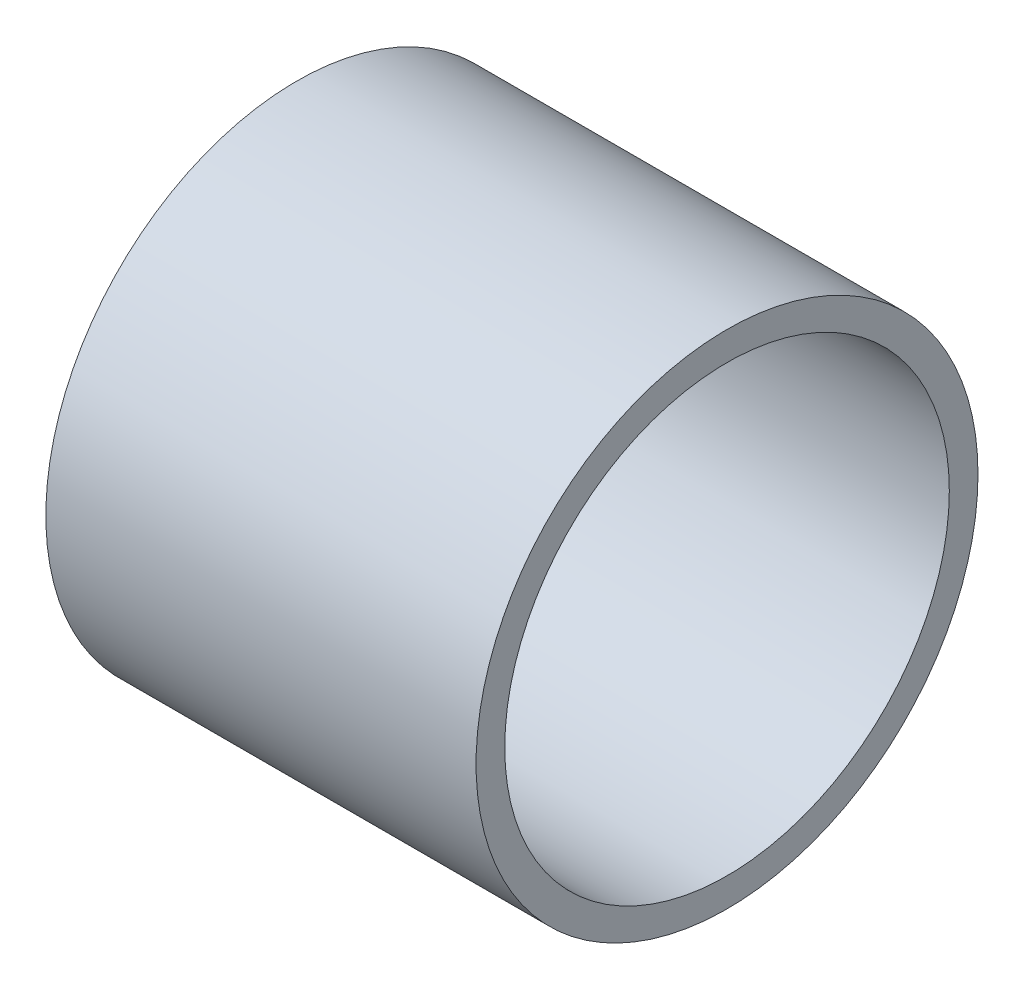
ISO-10303-21;
HEADER;
FILE_DESCRIPTION(('STEP AP214'),'2;1');
FILE_NAME('part.step','',(''),(''),'','','');
FILE_SCHEMA(('AUTOMOTIVE_DESIGN { 1 0 10303 214 1 1 1 1 }'));
ENDSEC;
DATA;
#1=APPLICATION_CONTEXT('core data for automotive mechanical design processes');
#2=APPLICATION_PROTOCOL_DEFINITION('international standard','automotive_design',2000,#1);
#3=PRODUCT_CONTEXT('',#1,'mechanical');
#4=PRODUCT('Part','Part','',(#3));
#5=PRODUCT_RELATED_PRODUCT_CATEGORY('part','',(#4));
#6=PRODUCT_DEFINITION_FORMATION('','',#4);
#7=PRODUCT_DEFINITION_CONTEXT('part definition',#1,'design');
#8=PRODUCT_DEFINITION('design','',#6,#7);
#9=PRODUCT_DEFINITION_SHAPE('','',#8);
#10=(LENGTH_UNIT() NAMED_UNIT(*) SI_UNIT(.MILLI.,.METRE.));
#11=(NAMED_UNIT(*) PLANE_ANGLE_UNIT() SI_UNIT($,.RADIAN.));
#12=(NAMED_UNIT(*) SI_UNIT($,.STERADIAN.) SOLID_ANGLE_UNIT());
#13=UNCERTAINTY_MEASURE_WITH_UNIT(LENGTH_MEASURE(1.E-05),#10,'distance_accuracy_value','');
#14=(GEOMETRIC_REPRESENTATION_CONTEXT(3) GLOBAL_UNCERTAINTY_ASSIGNED_CONTEXT((#13)) GLOBAL_UNIT_ASSIGNED_CONTEXT((#10,
#11,#12)) REPRESENTATION_CONTEXT('',''));
#15=CARTESIAN_POINT('',(0.,0.,0.));
#16=DIRECTION('',(0.,0.,1.));
#17=DIRECTION('',(1.,0.,0.));
#18=AXIS2_PLACEMENT_3D('',#15,#16,#17);
#19=CARTESIAN_POINT('',(60.0000000000001,-2.77555756156289E-13,-1.11022302462516E-12));
#20=DIRECTION('',(1.,0.,0.));
#21=DIRECTION('',(0.,0.,-1.00000000000001));
#22=AXIS2_PLACEMENT_3D('',#19,#20,#21);
#23=PLANE('',#22);
#24=CARTESIAN_POINT('',(60.0000000000001,-2.77555756156289E-13,-1.11022302462516E-12));
#25=DIRECTION('',(1.,0.,0.));
#26=DIRECTION('',(0.,0.,-1.00000000000001));
#27=AXIS2_PLACEMENT_3D('',#24,#25,#26);
#28=CIRCLE('',#27,35.);
#29=CARTESIAN_POINT('',(60.0000000000001,-2.7075564013046E-13,-35.0000000000014));
#30=VERTEX_POINT('',#29);
#31=EDGE_CURVE('E10',#30,#30,#28,.T.);
#32=ORIENTED_EDGE('',*,*,#31,.T.);
#33=EDGE_LOOP('',(#32));
#34=FACE_BOUND('',#33,.T.);
#35=CARTESIAN_POINT('',(60.0000000000001,-2.77555756156289E-13,-1.11022302462516E-12));
#36=DIRECTION('',(1.,0.,0.));
#37=DIRECTION('',(0.,0.,-1.00000000000001));
#38=AXIS2_PLACEMENT_3D('',#35,#36,#37);
#39=CIRCLE('',#38,31.);
#40=CARTESIAN_POINT('',(60.0000000000001,-2.71532796247698E-13,-31.0000000000013));
#41=VERTEX_POINT('',#40);
#42=EDGE_CURVE('E41',#41,#41,#39,.T.);
#43=ORIENTED_EDGE('',*,*,#42,.F.);
#44=EDGE_LOOP('',(#43));
#45=FACE_BOUND('',#44,.T.);
#46=ADVANCED_FACE('F30',(#34,#45),#23,.T.);
#47=CARTESIAN_POINT('',(0.,0.,0.));
#48=DIRECTION('',(1.,0.,0.));
#49=DIRECTION('',(0.,0.,-1.00000000000001));
#50=AXIS2_PLACEMENT_3D('',#47,#48,#49);
#51=PLANE('',#50);
#52=CARTESIAN_POINT('',(0.,0.,0.));
#53=DIRECTION('',(1.,0.,0.));
#54=DIRECTION('',(0.,0.,-1.00000000000001));
#55=AXIS2_PLACEMENT_3D('',#52,#53,#54);
#56=CIRCLE('',#55,35.);
#57=CARTESIAN_POINT('',(0.,0.,-35.0000000000002));
#58=VERTEX_POINT('',#57);
#59=EDGE_CURVE('E34',#58,#58,#56,.T.);
#60=ORIENTED_EDGE('',*,*,#59,.F.);
#61=EDGE_LOOP('',(#60));
#62=FACE_BOUND('',#61,.T.);
#63=CARTESIAN_POINT('',(0.,0.,0.));
#64=DIRECTION('',(1.,0.,0.));
#65=DIRECTION('',(0.,0.,-1.00000000000001));
#66=AXIS2_PLACEMENT_3D('',#63,#64,#65);
#67=CIRCLE('',#66,31.);
#68=CARTESIAN_POINT('',(0.,0.,-31.0000000000002));
#69=VERTEX_POINT('',#68);
#70=EDGE_CURVE('E43',#69,#69,#67,.T.);
#71=ORIENTED_EDGE('',*,*,#70,.T.);
#72=EDGE_LOOP('',(#71));
#73=FACE_BOUND('',#72,.T.);
#74=ADVANCED_FACE('F53',(#62,#73),#51,.F.);
#75=CARTESIAN_POINT('',(60.0000000000001,-2.77555756156289E-13,-1.11022302462516E-12));
#76=DIRECTION('',(-1.,0.,0.));
#77=DIRECTION('',(0.,0.,1.00000000000001));
#78=AXIS2_PLACEMENT_3D('',#75,#76,#77);
#79=CYLINDRICAL_SURFACE('',#78,35.);
#80=ORIENTED_EDGE('',*,*,#31,.F.);
#81=EDGE_LOOP('',(#80));
#82=FACE_BOUND('',#81,.T.);
#83=ORIENTED_EDGE('',*,*,#59,.T.);
#84=EDGE_LOOP('',(#83));
#85=FACE_BOUND('',#84,.T.);
#86=ADVANCED_FACE('F32',(#82,#85),#79,.T.);
#87=CARTESIAN_POINT('',(60.0000000000001,-2.77555756156289E-13,-1.11022302462516E-12));
#88=DIRECTION('',(-1.,0.,0.));
#89=DIRECTION('',(0.,0.,1.00000000000001));
#90=AXIS2_PLACEMENT_3D('',#87,#88,#89);
#91=CYLINDRICAL_SURFACE('',#90,31.);
#92=ORIENTED_EDGE('',*,*,#42,.T.);
#93=EDGE_LOOP('',(#92));
#94=FACE_BOUND('',#93,.T.);
#95=ORIENTED_EDGE('',*,*,#70,.F.);
#96=EDGE_LOOP('',(#95));
#97=FACE_BOUND('',#96,.T.);
#98=ADVANCED_FACE('F49',(#94,#97),#91,.F.);
#99=CLOSED_SHELL('',(#46,#74,#86,#98));
#100=MANIFOLD_SOLID_BREP('B2',#99);
#101=ADVANCED_BREP_SHAPE_REPRESENTATION('',(#18,#100),#14);
#102=SHAPE_DEFINITION_REPRESENTATION(#9,#101);
ENDSEC;
END-ISO-10303-21;
